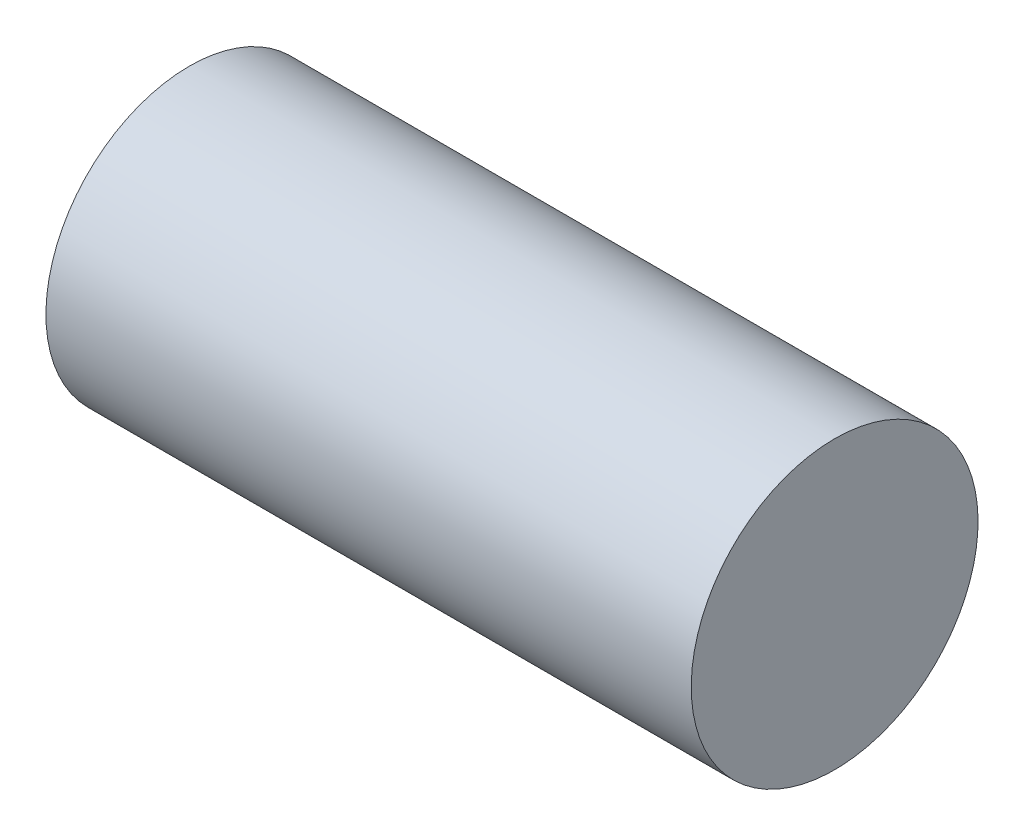
ISO-10303-21;
HEADER;
FILE_DESCRIPTION(('STEP AP214'),'2;1');
FILE_NAME('part.step','',(''),(''),'','','');
FILE_SCHEMA(('AUTOMOTIVE_DESIGN { 1 0 10303 214 1 1 1 1 }'));
ENDSEC;
DATA;
#1=APPLICATION_CONTEXT('core data for automotive mechanical design processes');
#2=APPLICATION_PROTOCOL_DEFINITION('international standard','automotive_design',2000,#1);
#3=PRODUCT_CONTEXT('',#1,'mechanical');
#4=PRODUCT('Part','Part','',(#3));
#5=PRODUCT_RELATED_PRODUCT_CATEGORY('part','',(#4));
#6=PRODUCT_DEFINITION_FORMATION('','',#4);
#7=PRODUCT_DEFINITION_CONTEXT('part definition',#1,'design');
#8=PRODUCT_DEFINITION('design','',#6,#7);
#9=PRODUCT_DEFINITION_SHAPE('','',#8);
#10=(LENGTH_UNIT() NAMED_UNIT(*) SI_UNIT(.MILLI.,.METRE.));
#11=(NAMED_UNIT(*) PLANE_ANGLE_UNIT() SI_UNIT($,.RADIAN.));
#12=(NAMED_UNIT(*) SI_UNIT($,.STERADIAN.) SOLID_ANGLE_UNIT());
#13=UNCERTAINTY_MEASURE_WITH_UNIT(LENGTH_MEASURE(1.E-05),#10,'distance_accuracy_value','');
#14=(GEOMETRIC_REPRESENTATION_CONTEXT(3) GLOBAL_UNCERTAINTY_ASSIGNED_CONTEXT((#13)) GLOBAL_UNIT_ASSIGNED_CONTEXT((#10,
#11,#12)) REPRESENTATION_CONTEXT('',''));
#15=CARTESIAN_POINT('',(0.,0.,0.));
#16=DIRECTION('',(0.,0.,1.));
#17=DIRECTION('',(1.,0.,0.));
#18=AXIS2_PLACEMENT_3D('',#15,#16,#17);
#19=CARTESIAN_POINT('',(18.,0.,0.));
#20=DIRECTION('',(-1.,0.,0.));
#21=DIRECTION('',(0.,0.,1.));
#22=AXIS2_PLACEMENT_3D('',#19,#20,#21);
#23=PLANE('',#22);
#24=CARTESIAN_POINT('',(18.,0.,0.));
#25=DIRECTION('',(-1.,0.,0.));
#26=DIRECTION('',(0.,-1.,0.));
#27=AXIS2_PLACEMENT_3D('',#24,#25,#26);
#28=CIRCLE('',#27,4.);
#29=CARTESIAN_POINT('',(18.,4.,0.));
#30=VERTEX_POINT('',#29);
#31=EDGE_CURVE('E27',#30,#30,#28,.T.);
#32=ORIENTED_EDGE('',*,*,#31,.F.);
#33=EDGE_LOOP('',(#32));
#34=FACE_BOUND('',#33,.T.);
#35=ADVANCED_FACE('F16',(#34),#23,.F.);
#36=CARTESIAN_POINT('',(0.,0.,0.));
#37=DIRECTION('',(-1.,0.,0.));
#38=DIRECTION('',(0.,0.,1.));
#39=AXIS2_PLACEMENT_3D('',#36,#37,#38);
#40=PLANE('',#39);
#41=DIRECTION('',(0.,-1.,0.));
#42=VECTOR('',#41,1.);
#43=CARTESIAN_POINT('',(0.,1.3228756555323,-3.));
#44=LINE('',#43,#42);
#45=CARTESIAN_POINT('',(0.,2.64575131106459,-3.));
#46=VERTEX_POINT('',#45);
#47=CARTESIAN_POINT('',(0.,-2.64575131106459,-3.));
#48=VERTEX_POINT('',#47);
#49=EDGE_CURVE('E73',#46,#48,#44,.T.);
#50=ORIENTED_EDGE('',*,*,#49,.T.);
#51=CARTESIAN_POINT('',(0.,0.,0.));
#52=DIRECTION('',(-1.,0.,0.));
#53=DIRECTION('',(0.,-1.,0.));
#54=AXIS2_PLACEMENT_3D('',#51,#52,#53);
#55=CIRCLE('',#54,4.);
#56=CARTESIAN_POINT('',(0.,4.,0.));
#57=VERTEX_POINT('',#56);
#58=EDGE_CURVE('E11',#48,#57,#55,.T.);
#59=ORIENTED_EDGE('',*,*,#58,.T.);
#60=CARTESIAN_POINT('',(0.,0.,0.));
#61=DIRECTION('',(-1.,0.,0.));
#62=DIRECTION('',(0.,-1.,0.));
#63=AXIS2_PLACEMENT_3D('',#60,#61,#62);
#64=CIRCLE('',#63,4.);
#65=EDGE_CURVE('E75',#57,#46,#64,.T.);
#66=ORIENTED_EDGE('',*,*,#65,.T.);
#67=EDGE_LOOP('',(#50,#59,#66));
#68=FACE_BOUND('',#67,.T.);
#69=ADVANCED_FACE('F74',(#68),#40,.T.);
#70=CARTESIAN_POINT('',(18.,0.,0.));
#71=DIRECTION('',(-1.,0.,0.));
#72=DIRECTION('',(0.,-1.,0.));
#73=AXIS2_PLACEMENT_3D('',#70,#71,#72);
#74=CYLINDRICAL_SURFACE('',#73,4.);
#75=DIRECTION('',(1.,0.,0.));
#76=VECTOR('',#75,1.);
#77=CARTESIAN_POINT('',(18.,-2.64575131106459,-3.));
#78=LINE('',#77,#76);
#79=CARTESIAN_POINT('',(15.,-2.64575131106459,-3.));
#80=VERTEX_POINT('',#79);
#81=EDGE_CURVE('E68',#48,#80,#78,.T.);
#82=ORIENTED_EDGE('',*,*,#81,.T.);
#83=CARTESIAN_POINT('',(15.,0.,0.));
#84=DIRECTION('',(1.,0.,0.));
#85=DIRECTION('',(0.,-1.,0.));
#86=AXIS2_PLACEMENT_3D('',#83,#84,#85);
#87=CIRCLE('',#86,4.);
#88=CARTESIAN_POINT('',(15.,2.64575131106459,-3.));
#89=VERTEX_POINT('',#88);
#90=EDGE_CURVE('E55',#80,#89,#87,.T.);
#91=ORIENTED_EDGE('',*,*,#90,.T.);
#92=DIRECTION('',(-1.,0.,0.));
#93=VECTOR('',#92,1.);
#94=CARTESIAN_POINT('',(18.,2.64575131106459,-3.));
#95=LINE('',#94,#93);
#96=EDGE_CURVE('E78',#89,#46,#95,.T.);
#97=ORIENTED_EDGE('',*,*,#96,.T.);
#98=ORIENTED_EDGE('',*,*,#65,.F.);
#99=DIRECTION('',(1.,0.,0.));
#100=VECTOR('',#99,1.);
#101=CARTESIAN_POINT('',(18.,4.,0.));
#102=LINE('',#101,#100);
#103=EDGE_CURVE('E20',#57,#30,#102,.T.);
#104=ORIENTED_EDGE('',*,*,#103,.T.);
#105=ORIENTED_EDGE('',*,*,#31,.T.);
#106=ORIENTED_EDGE('',*,*,#103,.F.);
#107=ORIENTED_EDGE('',*,*,#58,.F.);
#108=EDGE_LOOP('',(#82,#91,#97,#98,#104,#105,#106,#107));
#109=FACE_BOUND('',#108,.T.);
#110=ADVANCED_FACE('F66',(#109),#74,.T.);
#111=CARTESIAN_POINT('',(15.,0.,-3.5));
#112=DIRECTION('',(-1.,0.,0.));
#113=DIRECTION('',(0.,0.,1.));
#114=AXIS2_PLACEMENT_3D('',#111,#112,#113);
#115=PLANE('',#114);
#116=DIRECTION('',(0.,-1.,0.));
#117=VECTOR('',#116,1.);
#118=CARTESIAN_POINT('',(15.,1.3228756555323,-3.));
#119=LINE('',#118,#117);
#120=EDGE_CURVE('E80',#89,#80,#119,.T.);
#121=ORIENTED_EDGE('',*,*,#120,.F.);
#122=ORIENTED_EDGE('',*,*,#90,.F.);
#123=EDGE_LOOP('',(#121,#122));
#124=FACE_BOUND('',#123,.T.);
#125=ADVANCED_FACE('F18',(#124),#115,.T.);
#126=CARTESIAN_POINT('',(0.,2.64575131106459,-3.));
#127=DIRECTION('',(0.,0.,1.));
#128=DIRECTION('',(1.,0.,0.));
#129=AXIS2_PLACEMENT_3D('',#126,#127,#128);
#130=PLANE('',#129);
#131=ORIENTED_EDGE('',*,*,#120,.T.);
#132=ORIENTED_EDGE('',*,*,#81,.F.);
#133=ORIENTED_EDGE('',*,*,#49,.F.);
#134=ORIENTED_EDGE('',*,*,#96,.F.);
#135=EDGE_LOOP('',(#131,#132,#133,#134));
#136=FACE_BOUND('',#135,.T.);
#137=ADVANCED_FACE('F79',(#136),#130,.F.);
#138=CLOSED_SHELL('',(#35,#69,#110,#125,#137));
#139=MANIFOLD_SOLID_BREP('B1',#138);
#140=ADVANCED_BREP_SHAPE_REPRESENTATION('',(#18,#139),#14);
#141=SHAPE_DEFINITION_REPRESENTATION(#9,#140);
ENDSEC;
END-ISO-10303-21;
